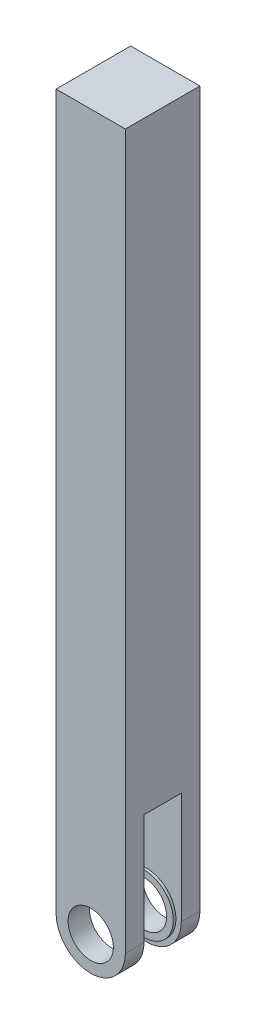
ISO-10303-21;
HEADER;
FILE_DESCRIPTION(('STEP AP214'),'2;1');
FILE_NAME('part.step','',(''),(''),'','','');
FILE_SCHEMA(('AUTOMOTIVE_DESIGN { 1 0 10303 214 1 1 1 1 }'));
ENDSEC;
DATA;
#1=APPLICATION_CONTEXT('core data for automotive mechanical design processes');
#2=APPLICATION_PROTOCOL_DEFINITION('international standard','automotive_design',2000,#1);
#3=PRODUCT_CONTEXT('',#1,'mechanical');
#4=PRODUCT('Part','Part','',(#3));
#5=PRODUCT_RELATED_PRODUCT_CATEGORY('part','',(#4));
#6=PRODUCT_DEFINITION_FORMATION('','',#4);
#7=PRODUCT_DEFINITION_CONTEXT('part definition',#1,'design');
#8=PRODUCT_DEFINITION('design','',#6,#7);
#9=PRODUCT_DEFINITION_SHAPE('','',#8);
#10=(LENGTH_UNIT() NAMED_UNIT(*) SI_UNIT(.MILLI.,.METRE.));
#11=(NAMED_UNIT(*) PLANE_ANGLE_UNIT() SI_UNIT($,.RADIAN.));
#12=(NAMED_UNIT(*) SI_UNIT($,.STERADIAN.) SOLID_ANGLE_UNIT());
#13=UNCERTAINTY_MEASURE_WITH_UNIT(LENGTH_MEASURE(1.E-05),#10,'distance_accuracy_value','');
#14=(GEOMETRIC_REPRESENTATION_CONTEXT(3) GLOBAL_UNCERTAINTY_ASSIGNED_CONTEXT((#13)) GLOBAL_UNIT_ASSIGNED_CONTEXT((#10,
#11,#12)) REPRESENTATION_CONTEXT('',''));
#15=CARTESIAN_POINT('',(0.,0.,0.));
#16=DIRECTION('',(0.,0.,1.));
#17=DIRECTION('',(1.,0.,0.));
#18=AXIS2_PLACEMENT_3D('',#15,#16,#17);
#19=CARTESIAN_POINT('',(26.,-345.981347093024,91.8721133177629));
#20=DIRECTION('',(0.,0.,-1.));
#21=DIRECTION('',(-1.,0.,0.));
#22=AXIS2_PLACEMENT_3D('',#19,#20,#21);
#23=PLANE('',#22);
#24=CARTESIAN_POINT('',(13.,-387.882361344585,91.8721133177629));
#25=DIRECTION('',(0.,0.,-1.));
#26=DIRECTION('',(-1.,0.,0.));
#27=AXIS2_PLACEMENT_3D('',#24,#25,#26);
#28=CIRCLE('',#27,13.);
#29=CARTESIAN_POINT('',(0.,-387.882361344585,91.8721133177629));
#30=VERTEX_POINT('',#29);
#31=CARTESIAN_POINT('',(13.,-400.882361344585,91.8721133177629));
#32=VERTEX_POINT('',#31);
#33=EDGE_CURVE('E71',#30,#32,#28,.F.);
#34=ORIENTED_EDGE('',*,*,#33,.T.);
#35=CARTESIAN_POINT('',(13.,-387.882361344585,91.8721133177629));
#36=DIRECTION('',(0.,0.,-1.));
#37=DIRECTION('',(-1.,0.,0.));
#38=AXIS2_PLACEMENT_3D('',#35,#36,#37);
#39=CIRCLE('',#38,13.);
#40=CARTESIAN_POINT('',(26.,-387.882361344585,91.8721133177629));
#41=VERTEX_POINT('',#40);
#42=EDGE_CURVE('E232',#32,#41,#39,.F.);
#43=ORIENTED_EDGE('',*,*,#42,.T.);
#44=DIRECTION('',(0.,-1.,0.));
#45=VECTOR('',#44,1.);
#46=CARTESIAN_POINT('',(26.,-345.981347093024,91.8721133177629));
#47=LINE('',#46,#45);
#48=CARTESIAN_POINT('',(26.,-345.981347093024,91.8721133177629));
#49=VERTEX_POINT('',#48);
#50=EDGE_CURVE('E175',#49,#41,#47,.T.);
#51=ORIENTED_EDGE('',*,*,#50,.F.);
#52=DIRECTION('',(-1.,0.,0.));
#53=VECTOR('',#52,1.);
#54=CARTESIAN_POINT('',(26.,-345.981347093024,91.8721133177629));
#55=LINE('',#54,#53);
#56=CARTESIAN_POINT('',(0.,-345.981347093024,91.8721133177629));
#57=VERTEX_POINT('',#56);
#58=EDGE_CURVE('E178',#49,#57,#55,.T.);
#59=ORIENTED_EDGE('',*,*,#58,.T.);
#60=DIRECTION('',(0.,-1.,0.));
#61=VECTOR('',#60,1.);
#62=CARTESIAN_POINT('',(0.,-345.981347093024,91.8721133177629));
#63=LINE('',#62,#61);
#64=EDGE_CURVE('E147',#57,#30,#63,.T.);
#65=ORIENTED_EDGE('',*,*,#64,.T.);
#66=EDGE_LOOP('',(#34,#43,#51,#59,#65));
#67=FACE_BOUND('',#66,.T.);
#68=CARTESIAN_POINT('',(13.,-387.882361344585,91.8721133177629));
#69=DIRECTION('',(0.,0.,-1.));
#70=DIRECTION('',(-1.,0.,0.));
#71=AXIS2_PLACEMENT_3D('',#68,#69,#70);
#72=CIRCLE('',#71,11.);
#73=CARTESIAN_POINT('',(1.99999999999998,-387.882361344585,91.8721133177629));
#74=VERTEX_POINT('',#73);
#75=EDGE_CURVE('E12',#74,#74,#72,.F.);
#76=ORIENTED_EDGE('',*,*,#75,.F.);
#77=EDGE_LOOP('',(#76));
#78=FACE_BOUND('',#77,.T.);
#79=ADVANCED_FACE('F55',(#67,#78),#23,.F.);
#80=CARTESIAN_POINT('',(26.,-369.669881286705,84.8721133177628));
#81=DIRECTION('',(0.,0.,1.));
#82=DIRECTION('',(1.,0.,0.));
#83=AXIS2_PLACEMENT_3D('',#80,#81,#82);
#84=PLANE('',#83);
#85=CARTESIAN_POINT('',(13.,-387.882361344585,84.8721133177628));
#86=DIRECTION('',(0.,0.,1.));
#87=DIRECTION('',(1.,0.,0.));
#88=AXIS2_PLACEMENT_3D('',#85,#86,#87);
#89=CIRCLE('',#88,8.49999999999999);
#90=CARTESIAN_POINT('',(21.5,-387.882361344585,84.8721133177628));
#91=VERTEX_POINT('',#90);
#92=EDGE_CURVE('E182',#91,#91,#89,.T.);
#93=ORIENTED_EDGE('',*,*,#92,.T.);
#94=EDGE_LOOP('',(#93));
#95=FACE_BOUND('',#94,.T.);
#96=DIRECTION('',(0.,1.,0.));
#97=VECTOR('',#96,1.);
#98=CARTESIAN_POINT('',(26.,-369.669881286705,84.8721133177628));
#99=LINE('',#98,#97);
#100=CARTESIAN_POINT('',(26.,-387.882361344585,84.8721133177628));
#101=VERTEX_POINT('',#100);
#102=CARTESIAN_POINT('',(26.,-119.459461352602,84.8721133177628));
#103=VERTEX_POINT('',#102);
#104=EDGE_CURVE('E135',#101,#103,#99,.T.);
#105=ORIENTED_EDGE('',*,*,#104,.F.);
#106=CARTESIAN_POINT('',(13.,-387.882361344585,84.8721133177628));
#107=DIRECTION('',(0.,0.,1.));
#108=DIRECTION('',(1.,0.,0.));
#109=AXIS2_PLACEMENT_3D('',#106,#107,#108);
#110=CIRCLE('',#109,13.);
#111=CARTESIAN_POINT('',(13.,-400.882361344585,84.8721133177628));
#112=VERTEX_POINT('',#111);
#113=EDGE_CURVE('E227',#101,#112,#110,.F.);
#114=ORIENTED_EDGE('',*,*,#113,.T.);
#115=CARTESIAN_POINT('',(13.,-387.882361344585,84.8721133177628));
#116=DIRECTION('',(0.,0.,1.));
#117=DIRECTION('',(1.,0.,0.));
#118=AXIS2_PLACEMENT_3D('',#115,#116,#117);
#119=CIRCLE('',#118,13.);
#120=CARTESIAN_POINT('',(0.,-387.882361344585,84.8721133177628));
#121=VERTEX_POINT('',#120);
#122=EDGE_CURVE('E224',#112,#121,#119,.F.);
#123=ORIENTED_EDGE('',*,*,#122,.T.);
#124=DIRECTION('',(0.,1.,0.));
#125=VECTOR('',#124,1.);
#126=CARTESIAN_POINT('',(0.,-369.669881286705,84.8721133177628));
#127=LINE('',#126,#125);
#128=CARTESIAN_POINT('',(0.,-119.459461352602,84.8721133177628));
#129=VERTEX_POINT('',#128);
#130=EDGE_CURVE('E152',#121,#129,#127,.T.);
#131=ORIENTED_EDGE('',*,*,#130,.T.);
#132=DIRECTION('',(-1.,0.,0.));
#133=VECTOR('',#132,1.);
#134=CARTESIAN_POINT('',(26.,-119.459461352602,84.8721133177628));
#135=LINE('',#134,#133);
#136=EDGE_CURVE('E150',#103,#129,#135,.T.);
#137=ORIENTED_EDGE('',*,*,#136,.F.);
#138=EDGE_LOOP('',(#105,#114,#123,#131,#137));
#139=FACE_BOUND('',#138,.T.);
#140=ADVANCED_FACE('F151',(#95,#139),#84,.F.);
#141=CARTESIAN_POINT('',(26.,-119.459461352602,84.8721133177628));
#142=DIRECTION('',(0.,-1.,0.));
#143=DIRECTION('',(0.,0.,-1.));
#144=AXIS2_PLACEMENT_3D('',#141,#142,#143);
#145=PLANE('',#144);
#146=DIRECTION('',(0.,0.,1.));
#147=VECTOR('',#146,1.);
#148=CARTESIAN_POINT('',(0.,-119.459461352602,84.8721133177628));
#149=LINE('',#148,#147);
#150=CARTESIAN_POINT('',(0.,-119.459461352602,112.872113317763));
#151=VERTEX_POINT('',#150);
#152=EDGE_CURVE('E181',#129,#151,#149,.T.);
#153=ORIENTED_EDGE('',*,*,#152,.T.);
#154=DIRECTION('',(-1.,0.,0.));
#155=VECTOR('',#154,1.);
#156=CARTESIAN_POINT('',(26.,-119.459461352602,112.872113317763));
#157=LINE('',#156,#155);
#158=CARTESIAN_POINT('',(26.,-119.459461352602,112.872113317763));
#159=VERTEX_POINT('',#158);
#160=EDGE_CURVE('E157',#159,#151,#157,.T.);
#161=ORIENTED_EDGE('',*,*,#160,.F.);
#162=DIRECTION('',(0.,0.,1.));
#163=VECTOR('',#162,1.);
#164=CARTESIAN_POINT('',(26.,-119.459461352602,84.8721133177628));
#165=LINE('',#164,#163);
#166=EDGE_CURVE('E140',#103,#159,#165,.T.);
#167=ORIENTED_EDGE('',*,*,#166,.F.);
#168=ORIENTED_EDGE('',*,*,#136,.T.);
#169=EDGE_LOOP('',(#153,#161,#167,#168));
#170=FACE_BOUND('',#169,.T.);
#171=ADVANCED_FACE('F159',(#170),#145,.F.);
#172=CARTESIAN_POINT('',(26.,-369.669881286705,112.872113317763));
#173=DIRECTION('',(0.,0.,-1.));
#174=DIRECTION('',(-1.,0.,0.));
#175=AXIS2_PLACEMENT_3D('',#172,#173,#174);
#176=PLANE('',#175);
#177=CARTESIAN_POINT('',(13.,-387.567582275841,112.872113317763));
#178=DIRECTION('',(0.,0.,-1.));
#179=DIRECTION('',(-1.,0.,0.));
#180=AXIS2_PLACEMENT_3D('',#177,#178,#179);
#181=CIRCLE('',#180,13.);
#182=CARTESIAN_POINT('',(0.,-387.567582275841,112.872113317763));
#183=VERTEX_POINT('',#182);
#184=CARTESIAN_POINT('',(13.,-400.567582275841,112.872113317763));
#185=VERTEX_POINT('',#184);
#186=EDGE_CURVE('E218',#183,#185,#181,.F.);
#187=ORIENTED_EDGE('',*,*,#186,.T.);
#188=CARTESIAN_POINT('',(13.,-387.567582275841,112.872113317763));
#189=DIRECTION('',(0.,0.,-1.));
#190=DIRECTION('',(-1.,0.,0.));
#191=AXIS2_PLACEMENT_3D('',#188,#189,#190);
#192=CIRCLE('',#191,13.);
#193=CARTESIAN_POINT('',(26.,-387.567582275841,112.872113317763));
#194=VERTEX_POINT('',#193);
#195=EDGE_CURVE('E221',#185,#194,#192,.F.);
#196=ORIENTED_EDGE('',*,*,#195,.T.);
#197=DIRECTION('',(0.,-1.,0.));
#198=VECTOR('',#197,1.);
#199=CARTESIAN_POINT('',(26.,-369.669881286705,112.872113317763));
#200=LINE('',#199,#198);
#201=EDGE_CURVE('E163',#159,#194,#200,.T.);
#202=ORIENTED_EDGE('',*,*,#201,.F.);
#203=ORIENTED_EDGE('',*,*,#160,.T.);
#204=DIRECTION('',(0.,-1.,0.));
#205=VECTOR('',#204,1.);
#206=CARTESIAN_POINT('',(0.,-369.669881286705,112.872113317763));
#207=LINE('',#206,#205);
#208=EDGE_CURVE('E185',#151,#183,#207,.T.);
#209=ORIENTED_EDGE('',*,*,#208,.T.);
#210=EDGE_LOOP('',(#187,#196,#202,#203,#209));
#211=FACE_BOUND('',#210,.T.);
#212=CARTESIAN_POINT('',(13.,-387.882361344585,112.872113317763));
#213=DIRECTION('',(0.,0.,1.));
#214=DIRECTION('',(1.,0.,0.));
#215=AXIS2_PLACEMENT_3D('',#212,#213,#214);
#216=CIRCLE('',#215,8.49999999999999);
#217=CARTESIAN_POINT('',(21.5,-387.882361344585,112.872113317763));
#218=VERTEX_POINT('',#217);
#219=EDGE_CURVE('E243',#218,#218,#216,.T.);
#220=ORIENTED_EDGE('',*,*,#219,.F.);
#221=EDGE_LOOP('',(#220));
#222=FACE_BOUND('',#221,.T.);
#223=ADVANCED_FACE('F313',(#211,#222),#176,.F.);
#224=CARTESIAN_POINT('',(26.,-345.981347093024,105.872113317763));
#225=DIRECTION('',(0.,0.,1.));
#226=DIRECTION('',(1.,0.,0.));
#227=AXIS2_PLACEMENT_3D('',#224,#225,#226);
#228=PLANE('',#227);
#229=CARTESIAN_POINT('',(13.,-387.882361344585,105.872113317763));
#230=DIRECTION('',(0.,0.,1.));
#231=DIRECTION('',(1.,0.,0.));
#232=AXIS2_PLACEMENT_3D('',#229,#230,#231);
#233=CIRCLE('',#232,11.);
#234=CARTESIAN_POINT('',(24.,-387.882361344585,105.872113317763));
#235=VERTEX_POINT('',#234);
#236=EDGE_CURVE('E247',#235,#235,#233,.T.);
#237=ORIENTED_EDGE('',*,*,#236,.T.);
#238=EDGE_LOOP('',(#237));
#239=FACE_BOUND('',#238,.T.);
#240=DIRECTION('',(0.,1.,0.));
#241=VECTOR('',#240,1.);
#242=CARTESIAN_POINT('',(26.,-345.981347093024,105.872113317763));
#243=LINE('',#242,#241);
#244=CARTESIAN_POINT('',(26.,-387.567582275841,105.872113317763));
#245=VERTEX_POINT('',#244);
#246=CARTESIAN_POINT('',(26.,-345.981347093024,105.872113317763));
#247=VERTEX_POINT('',#246);
#248=EDGE_CURVE('E166',#245,#247,#243,.T.);
#249=ORIENTED_EDGE('',*,*,#248,.F.);
#250=CARTESIAN_POINT('',(13.,-387.567582275841,105.872113317763));
#251=DIRECTION('',(0.,0.,1.));
#252=DIRECTION('',(1.,0.,0.));
#253=AXIS2_PLACEMENT_3D('',#250,#251,#252);
#254=CIRCLE('',#253,13.);
#255=CARTESIAN_POINT('',(13.,-400.567582275841,105.872113317763));
#256=VERTEX_POINT('',#255);
#257=EDGE_CURVE('E215',#245,#256,#254,.F.);
#258=ORIENTED_EDGE('',*,*,#257,.T.);
#259=CARTESIAN_POINT('',(13.,-387.567582275841,105.872113317763));
#260=DIRECTION('',(0.,0.,1.));
#261=DIRECTION('',(1.,0.,0.));
#262=AXIS2_PLACEMENT_3D('',#259,#260,#261);
#263=CIRCLE('',#262,13.);
#264=CARTESIAN_POINT('',(0.,-387.567582275841,105.872113317763));
#265=VERTEX_POINT('',#264);
#266=EDGE_CURVE('E212',#256,#265,#263,.F.);
#267=ORIENTED_EDGE('',*,*,#266,.T.);
#268=DIRECTION('',(0.,1.,0.));
#269=VECTOR('',#268,1.);
#270=CARTESIAN_POINT('',(0.,-345.981347093024,105.872113317763));
#271=LINE('',#270,#269);
#272=CARTESIAN_POINT('',(0.,-345.981347093024,105.872113317763));
#273=VERTEX_POINT('',#272);
#274=EDGE_CURVE('E189',#265,#273,#271,.T.);
#275=ORIENTED_EDGE('',*,*,#274,.T.);
#276=DIRECTION('',(-1.,0.,0.));
#277=VECTOR('',#276,1.);
#278=CARTESIAN_POINT('',(26.,-345.981347093024,105.872113317763));
#279=LINE('',#278,#277);
#280=EDGE_CURVE('E200',#247,#273,#279,.T.);
#281=ORIENTED_EDGE('',*,*,#280,.F.);
#282=EDGE_LOOP('',(#249,#258,#267,#275,#281));
#283=FACE_BOUND('',#282,.T.);
#284=ADVANCED_FACE('F309',(#239,#283),#228,.F.);
#285=CARTESIAN_POINT('',(26.,-345.981347093024,91.8721133177629));
#286=DIRECTION('',(0.,1.,0.));
#287=DIRECTION('',(0.,0.,1.));
#288=AXIS2_PLACEMENT_3D('',#285,#286,#287);
#289=PLANE('',#288);
#290=DIRECTION('',(0.,0.,-1.));
#291=VECTOR('',#290,1.);
#292=CARTESIAN_POINT('',(0.,-345.981347093024,91.8721133177629));
#293=LINE('',#292,#291);
#294=EDGE_CURVE('E192',#273,#57,#293,.T.);
#295=ORIENTED_EDGE('',*,*,#294,.T.);
#296=ORIENTED_EDGE('',*,*,#58,.F.);
#297=DIRECTION('',(0.,0.,-1.));
#298=VECTOR('',#297,1.);
#299=CARTESIAN_POINT('',(26.,-345.981347093024,91.8721133177629));
#300=LINE('',#299,#298);
#301=EDGE_CURVE('E172',#247,#49,#300,.T.);
#302=ORIENTED_EDGE('',*,*,#301,.F.);
#303=ORIENTED_EDGE('',*,*,#280,.T.);
#304=EDGE_LOOP('',(#295,#296,#302,#303));
#305=FACE_BOUND('',#304,.T.);
#306=ADVANCED_FACE('F306',(#305),#289,.F.);
#307=CARTESIAN_POINT('',(26.,0.,0.));
#308=DIRECTION('',(-1.,0.,0.));
#309=DIRECTION('',(0.,0.,1.));
#310=AXIS2_PLACEMENT_3D('',#307,#308,#309);
#311=PLANE('',#310);
#312=ORIENTED_EDGE('',*,*,#201,.T.);
#313=DIRECTION('',(0.,0.,-1.));
#314=VECTOR('',#313,1.);
#315=CARTESIAN_POINT('',(26.,-387.567582275841,0.));
#316=LINE('',#315,#314);
#317=EDGE_CURVE('E208',#194,#245,#316,.T.);
#318=ORIENTED_EDGE('',*,*,#317,.T.);
#319=ORIENTED_EDGE('',*,*,#248,.T.);
#320=ORIENTED_EDGE('',*,*,#301,.T.);
#321=ORIENTED_EDGE('',*,*,#50,.T.);
#322=DIRECTION('',(0.,0.,-1.));
#323=VECTOR('',#322,1.);
#324=CARTESIAN_POINT('',(26.,-387.882361344585,0.));
#325=LINE('',#324,#323);
#326=EDGE_CURVE('E144',#41,#101,#325,.T.);
#327=ORIENTED_EDGE('',*,*,#326,.T.);
#328=ORIENTED_EDGE('',*,*,#104,.T.);
#329=ORIENTED_EDGE('',*,*,#166,.T.);
#330=EDGE_LOOP('',(#312,#318,#319,#320,#321,#327,#328,#329));
#331=FACE_BOUND('',#330,.T.);
#332=ADVANCED_FACE('F138',(#331),#311,.F.);
#333=CARTESIAN_POINT('',(0.,0.,0.));
#334=DIRECTION('',(-1.,0.,0.));
#335=DIRECTION('',(0.,0.,1.));
#336=AXIS2_PLACEMENT_3D('',#333,#334,#335);
#337=PLANE('',#336);
#338=ORIENTED_EDGE('',*,*,#274,.F.);
#339=DIRECTION('',(0.,0.,-1.));
#340=VECTOR('',#339,1.);
#341=CARTESIAN_POINT('',(0.,-387.567582275841,112.872113317763));
#342=LINE('',#341,#340);
#343=EDGE_CURVE('E64',#265,#183,#342,.F.);
#344=ORIENTED_EDGE('',*,*,#343,.T.);
#345=ORIENTED_EDGE('',*,*,#208,.F.);
#346=ORIENTED_EDGE('',*,*,#152,.F.);
#347=ORIENTED_EDGE('',*,*,#130,.F.);
#348=DIRECTION('',(0.,0.,-1.));
#349=VECTOR('',#348,1.);
#350=CARTESIAN_POINT('',(0.,-387.882361344585,91.8721133177629));
#351=LINE('',#350,#349);
#352=EDGE_CURVE('E79',#121,#30,#351,.F.);
#353=ORIENTED_EDGE('',*,*,#352,.T.);
#354=ORIENTED_EDGE('',*,*,#64,.F.);
#355=ORIENTED_EDGE('',*,*,#294,.F.);
#356=EDGE_LOOP('',(#338,#344,#345,#346,#347,#353,#354,#355));
#357=FACE_BOUND('',#356,.T.);
#358=ADVANCED_FACE('F276',(#357),#337,.T.);
#359=CARTESIAN_POINT('',(13.,-387.882361344585,79.8721133177629));
#360=DIRECTION('',(0.,0.,1.));
#361=DIRECTION('',(1.,0.,0.));
#362=AXIS2_PLACEMENT_3D('',#359,#360,#361);
#363=CYLINDRICAL_SURFACE('',#362,8.49999999999999);
#364=ORIENTED_EDGE('',*,*,#92,.F.);
#365=EDGE_LOOP('',(#364));
#366=FACE_BOUND('',#365,.T.);
#367=CARTESIAN_POINT('',(13.,-387.882361344585,92.8721133177629));
#368=DIRECTION('',(0.,0.,1.));
#369=DIRECTION('',(1.,0.,0.));
#370=AXIS2_PLACEMENT_3D('',#367,#368,#369);
#371=CIRCLE('',#370,8.50000000000003);
#372=CARTESIAN_POINT('',(21.5,-387.882361344585,92.8721133177629));
#373=VERTEX_POINT('',#372);
#374=EDGE_CURVE('E280',#373,#373,#371,.T.);
#375=ORIENTED_EDGE('',*,*,#374,.T.);
#376=EDGE_LOOP('',(#375));
#377=FACE_BOUND('',#376,.T.);
#378=ADVANCED_FACE('F272',(#366,#377),#363,.F.);
#379=ORIENTED_EDGE('',*,*,#219,.T.);
#380=EDGE_LOOP('',(#379));
#381=FACE_BOUND('',#380,.T.);
#382=CARTESIAN_POINT('',(13.,-387.882361344585,104.872113317763));
#383=DIRECTION('',(0.,0.,1.));
#384=DIRECTION('',(1.,0.,0.));
#385=AXIS2_PLACEMENT_3D('',#382,#383,#384);
#386=CIRCLE('',#385,8.50000000000003);
#387=CARTESIAN_POINT('',(21.5,-387.882361344585,104.872113317763));
#388=VERTEX_POINT('',#387);
#389=EDGE_CURVE('E255',#388,#388,#386,.T.);
#390=ORIENTED_EDGE('',*,*,#389,.F.);
#391=EDGE_LOOP('',(#390));
#392=FACE_BOUND('',#391,.T.);
#393=ADVANCED_FACE('F275',(#381,#392),#363,.F.);
#394=CARTESIAN_POINT('',(13.,-387.567582275841,112.872113317763));
#395=DIRECTION('',(0.,0.,1.));
#396=DIRECTION('',(1.,0.,0.));
#397=AXIS2_PLACEMENT_3D('',#394,#395,#396);
#398=CYLINDRICAL_SURFACE('',#397,13.);
#399=DIRECTION('',(0.,0.,-1.));
#400=VECTOR('',#399,1.);
#401=CARTESIAN_POINT('',(13.,-400.567582275841,105.872113317763));
#402=LINE('',#401,#400);
#403=EDGE_CURVE('E239',#185,#256,#402,.T.);
#404=ORIENTED_EDGE('',*,*,#403,.F.);
#405=ORIENTED_EDGE('',*,*,#186,.F.);
#406=ORIENTED_EDGE('',*,*,#343,.F.);
#407=ORIENTED_EDGE('',*,*,#266,.F.);
#408=EDGE_LOOP('',(#404,#405,#406,#407));
#409=FACE_BOUND('',#408,.T.);
#410=ADVANCED_FACE('F322',(#409),#398,.T.);
#411=CARTESIAN_POINT('',(13.,-387.567582275841,0.));
#412=DIRECTION('',(0.,0.,-1.));
#413=DIRECTION('',(-1.,0.,0.));
#414=AXIS2_PLACEMENT_3D('',#411,#412,#413);
#415=CYLINDRICAL_SURFACE('',#414,13.);
#416=ORIENTED_EDGE('',*,*,#195,.F.);
#417=ORIENTED_EDGE('',*,*,#403,.T.);
#418=ORIENTED_EDGE('',*,*,#257,.F.);
#419=ORIENTED_EDGE('',*,*,#317,.F.);
#420=EDGE_LOOP('',(#416,#417,#418,#419));
#421=FACE_BOUND('',#420,.T.);
#422=ADVANCED_FACE('F319',(#421),#415,.T.);
#423=CARTESIAN_POINT('',(13.,-387.882361344585,84.8721133177628));
#424=DIRECTION('',(0.,0.,1.));
#425=DIRECTION('',(1.,0.,0.));
#426=AXIS2_PLACEMENT_3D('',#423,#424,#425);
#427=CYLINDRICAL_SURFACE('',#426,13.);
#428=DIRECTION('',(0.,0.,-1.));
#429=VECTOR('',#428,1.);
#430=CARTESIAN_POINT('',(13.,-400.882361344585,84.8721133177628));
#431=LINE('',#430,#429);
#432=EDGE_CURVE('E244',#32,#112,#431,.T.);
#433=ORIENTED_EDGE('',*,*,#432,.F.);
#434=ORIENTED_EDGE('',*,*,#33,.F.);
#435=ORIENTED_EDGE('',*,*,#352,.F.);
#436=ORIENTED_EDGE('',*,*,#122,.F.);
#437=EDGE_LOOP('',(#433,#434,#435,#436));
#438=FACE_BOUND('',#437,.T.);
#439=ADVANCED_FACE('F57',(#438),#427,.T.);
#440=CARTESIAN_POINT('',(13.,-387.882361344585,0.));
#441=DIRECTION('',(0.,0.,-1.));
#442=DIRECTION('',(-1.,0.,0.));
#443=AXIS2_PLACEMENT_3D('',#440,#441,#442);
#444=CYLINDRICAL_SURFACE('',#443,13.);
#445=ORIENTED_EDGE('',*,*,#42,.F.);
#446=ORIENTED_EDGE('',*,*,#432,.T.);
#447=ORIENTED_EDGE('',*,*,#113,.F.);
#448=ORIENTED_EDGE('',*,*,#326,.F.);
#449=EDGE_LOOP('',(#445,#446,#447,#448));
#450=FACE_BOUND('',#449,.T.);
#451=ADVANCED_FACE('F326',(#450),#444,.T.);
#452=CARTESIAN_POINT('',(13.,-387.882361344585,104.872113317763));
#453=DIRECTION('',(0.,0.,1.));
#454=DIRECTION('',(1.,0.,0.));
#455=AXIS2_PLACEMENT_3D('',#452,#453,#454);
#456=CYLINDRICAL_SURFACE('',#455,11.);
#457=CARTESIAN_POINT('',(13.,-387.882361344585,104.872113317763));
#458=DIRECTION('',(0.,0.,1.));
#459=DIRECTION('',(1.,0.,0.));
#460=AXIS2_PLACEMENT_3D('',#457,#458,#459);
#461=CIRCLE('',#460,11.);
#462=CARTESIAN_POINT('',(24.,-387.882361344585,104.872113317763));
#463=VERTEX_POINT('',#462);
#464=EDGE_CURVE('E250',#463,#463,#461,.T.);
#465=ORIENTED_EDGE('',*,*,#464,.T.);
#466=EDGE_LOOP('',(#465));
#467=FACE_BOUND('',#466,.T.);
#468=ORIENTED_EDGE('',*,*,#236,.F.);
#469=EDGE_LOOP('',(#468));
#470=FACE_BOUND('',#469,.T.);
#471=ADVANCED_FACE('F328',(#467,#470),#456,.T.);
#472=CARTESIAN_POINT('',(13.,-387.882361344585,104.872113317763));
#473=DIRECTION('',(0.,0.,1.));
#474=DIRECTION('',(1.,0.,0.));
#475=AXIS2_PLACEMENT_3D('',#472,#473,#474);
#476=PLANE('',#475);
#477=ORIENTED_EDGE('',*,*,#389,.T.);
#478=EDGE_LOOP('',(#477));
#479=FACE_BOUND('',#478,.T.);
#480=ORIENTED_EDGE('',*,*,#464,.F.);
#481=EDGE_LOOP('',(#480));
#482=FACE_BOUND('',#481,.T.);
#483=ADVANCED_FACE('F293',(#479,#482),#476,.F.);
#484=CARTESIAN_POINT('',(13.,-387.882361344585,92.8721133177629));
#485=DIRECTION('',(0.,0.,-1.));
#486=DIRECTION('',(-1.,0.,0.));
#487=AXIS2_PLACEMENT_3D('',#484,#485,#486);
#488=CYLINDRICAL_SURFACE('',#487,11.);
#489=CARTESIAN_POINT('',(13.,-387.882361344585,92.8721133177629));
#490=DIRECTION('',(0.,0.,1.));
#491=DIRECTION('',(1.,0.,0.));
#492=AXIS2_PLACEMENT_3D('',#489,#490,#491);
#493=CIRCLE('',#492,11.);
#494=CARTESIAN_POINT('',(24.,-387.882361344585,92.8721133177629));
#495=VERTEX_POINT('',#494);
#496=EDGE_CURVE('E261',#495,#495,#493,.T.);
#497=ORIENTED_EDGE('',*,*,#496,.F.);
#498=EDGE_LOOP('',(#497));
#499=FACE_BOUND('',#498,.T.);
#500=ORIENTED_EDGE('',*,*,#75,.T.);
#501=EDGE_LOOP('',(#500));
#502=FACE_BOUND('',#501,.T.);
#503=ADVANCED_FACE('F290',(#499,#502),#488,.T.);
#504=CARTESIAN_POINT('',(13.,-387.882361344585,92.8721133177629));
#505=DIRECTION('',(0.,0.,-1.));
#506=DIRECTION('',(1.,0.,0.));
#507=AXIS2_PLACEMENT_3D('',#504,#505,#506);
#508=PLANE('',#507);
#509=ORIENTED_EDGE('',*,*,#496,.T.);
#510=EDGE_LOOP('',(#509));
#511=FACE_BOUND('',#510,.T.);
#512=ORIENTED_EDGE('',*,*,#374,.F.);
#513=EDGE_LOOP('',(#512));
#514=FACE_BOUND('',#513,.T.);
#515=ADVANCED_FACE('F288',(#511,#514),#508,.F.);
#516=CLOSED_SHELL('',(#79,#140,#171,#223,#284,#306,#332,#358,#378,#393,#410,#422,#439,#451,#471,
#483,#503,#515));
#517=MANIFOLD_SOLID_BREP('B2',#516);
#518=ADVANCED_BREP_SHAPE_REPRESENTATION('',(#18,#517),#14);
#519=SHAPE_DEFINITION_REPRESENTATION(#9,#518);
ENDSEC;
END-ISO-10303-21;
